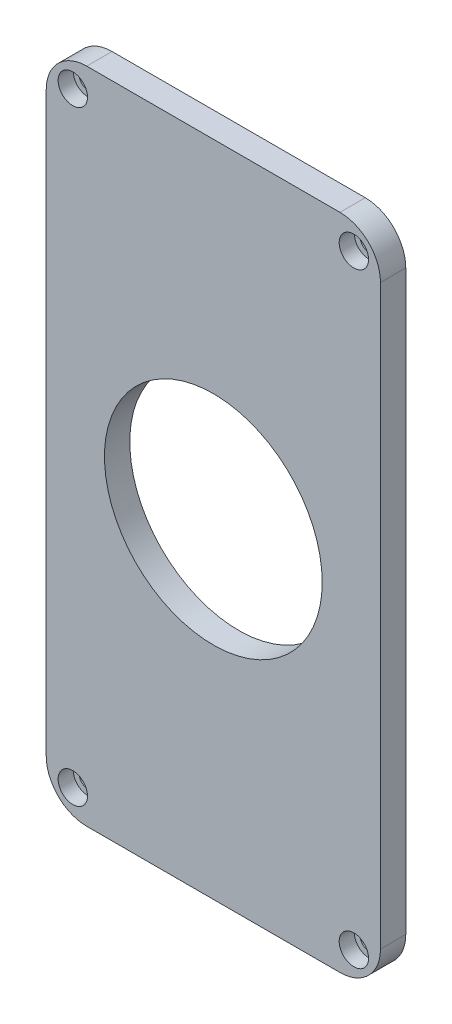
ISO-10303-21;
HEADER;
FILE_DESCRIPTION(('STEP AP214'),'2;1');
FILE_NAME('part.step','',(''),(''),'','','');
FILE_SCHEMA(('AUTOMOTIVE_DESIGN { 1 0 10303 214 1 1 1 1 }'));
ENDSEC;
DATA;
#1=APPLICATION_CONTEXT('core data for automotive mechanical design processes');
#2=APPLICATION_PROTOCOL_DEFINITION('international standard','automotive_design',2000,#1);
#3=PRODUCT_CONTEXT('',#1,'mechanical');
#4=PRODUCT('Part','Part','',(#3));
#5=PRODUCT_RELATED_PRODUCT_CATEGORY('part','',(#4));
#6=PRODUCT_DEFINITION_FORMATION('','',#4);
#7=PRODUCT_DEFINITION_CONTEXT('part definition',#1,'design');
#8=PRODUCT_DEFINITION('design','',#6,#7);
#9=PRODUCT_DEFINITION_SHAPE('','',#8);
#10=(LENGTH_UNIT() NAMED_UNIT(*) SI_UNIT(.MILLI.,.METRE.));
#11=(NAMED_UNIT(*) PLANE_ANGLE_UNIT() SI_UNIT($,.RADIAN.));
#12=(NAMED_UNIT(*) SI_UNIT($,.STERADIAN.) SOLID_ANGLE_UNIT());
#13=UNCERTAINTY_MEASURE_WITH_UNIT(LENGTH_MEASURE(1.E-05),#10,'distance_accuracy_value','');
#14=(GEOMETRIC_REPRESENTATION_CONTEXT(3) GLOBAL_UNCERTAINTY_ASSIGNED_CONTEXT((#13)) GLOBAL_UNIT_ASSIGNED_CONTEXT((#10,
#11,#12)) REPRESENTATION_CONTEXT('',''));
#15=CARTESIAN_POINT('',(0.,0.,0.));
#16=DIRECTION('',(0.,0.,1.));
#17=DIRECTION('',(1.,0.,0.));
#18=AXIS2_PLACEMENT_3D('',#15,#16,#17);
#19=CARTESIAN_POINT('',(-25.,-57.,5.));
#20=DIRECTION('',(0.,0.,-1.));
#21=DIRECTION('',(-1.,0.,0.));
#22=AXIS2_PLACEMENT_3D('',#19,#20,#21);
#23=CYLINDRICAL_SURFACE('',#22,8.);
#24=CARTESIAN_POINT('',(-25.,-57.,0.));
#25=DIRECTION('',(0.,0.,1.));
#26=DIRECTION('',(1.,0.,0.));
#27=AXIS2_PLACEMENT_3D('',#24,#25,#26);
#28=CIRCLE('',#27,8.);
#29=CARTESIAN_POINT('',(-33.,-57.,0.));
#30=VERTEX_POINT('',#29);
#31=CARTESIAN_POINT('',(-25.,-65.,0.));
#32=VERTEX_POINT('',#31);
#33=EDGE_CURVE('E143',#30,#32,#28,.T.);
#34=ORIENTED_EDGE('',*,*,#33,.T.);
#35=DIRECTION('',(0.,0.,-1.));
#36=VECTOR('',#35,1.);
#37=CARTESIAN_POINT('',(-25.,-65.,5.));
#38=LINE('',#37,#36);
#39=CARTESIAN_POINT('',(-25.,-65.,5.));
#40=VERTEX_POINT('',#39);
#41=EDGE_CURVE('E11',#40,#32,#38,.T.);
#42=ORIENTED_EDGE('',*,*,#41,.F.);
#43=CARTESIAN_POINT('',(-25.,-57.,5.));
#44=DIRECTION('',(0.,0.,1.));
#45=DIRECTION('',(1.,0.,0.));
#46=AXIS2_PLACEMENT_3D('',#43,#44,#45);
#47=CIRCLE('',#46,8.);
#48=CARTESIAN_POINT('',(-33.,-57.,5.));
#49=VERTEX_POINT('',#48);
#50=EDGE_CURVE('E158',#49,#40,#47,.T.);
#51=ORIENTED_EDGE('',*,*,#50,.F.);
#52=DIRECTION('',(0.,0.,-1.));
#53=VECTOR('',#52,1.);
#54=CARTESIAN_POINT('',(-33.,-57.,5.));
#55=LINE('',#54,#53);
#56=EDGE_CURVE('E139',#49,#30,#55,.T.);
#57=ORIENTED_EDGE('',*,*,#56,.T.);
#58=EDGE_LOOP('',(#34,#42,#51,#57));
#59=FACE_BOUND('',#58,.T.);
#60=ADVANCED_FACE('F47',(#59),#23,.T.);
#61=CARTESIAN_POINT('',(25.,-65.,5.));
#62=DIRECTION('',(0.,1.,0.));
#63=DIRECTION('',(0.,0.,1.));
#64=AXIS2_PLACEMENT_3D('',#61,#62,#63);
#65=PLANE('',#64);
#66=DIRECTION('',(1.,0.,0.));
#67=VECTOR('',#66,1.);
#68=CARTESIAN_POINT('',(25.,-65.,0.));
#69=LINE('',#68,#67);
#70=CARTESIAN_POINT('',(25.,-65.,0.));
#71=VERTEX_POINT('',#70);
#72=EDGE_CURVE('E146',#32,#71,#69,.T.);
#73=ORIENTED_EDGE('',*,*,#72,.T.);
#74=DIRECTION('',(0.,0.,-1.));
#75=VECTOR('',#74,1.);
#76=CARTESIAN_POINT('',(25.,-65.,5.));
#77=LINE('',#76,#75);
#78=CARTESIAN_POINT('',(25.,-65.,5.));
#79=VERTEX_POINT('',#78);
#80=EDGE_CURVE('E55',#79,#71,#77,.T.);
#81=ORIENTED_EDGE('',*,*,#80,.F.);
#82=DIRECTION('',(1.,0.,0.));
#83=VECTOR('',#82,1.);
#84=CARTESIAN_POINT('',(25.,-65.,5.));
#85=LINE('',#84,#83);
#86=EDGE_CURVE('E106',#40,#79,#85,.T.);
#87=ORIENTED_EDGE('',*,*,#86,.F.);
#88=ORIENTED_EDGE('',*,*,#41,.T.);
#89=EDGE_LOOP('',(#73,#81,#87,#88));
#90=FACE_BOUND('',#89,.T.);
#91=ADVANCED_FACE('F280',(#90),#65,.F.);
#92=CARTESIAN_POINT('',(25.,-57.,5.));
#93=DIRECTION('',(0.,0.,-1.));
#94=DIRECTION('',(-1.,0.,0.));
#95=AXIS2_PLACEMENT_3D('',#92,#93,#94);
#96=CYLINDRICAL_SURFACE('',#95,8.);
#97=CARTESIAN_POINT('',(25.,-57.,0.));
#98=DIRECTION('',(0.,0.,1.));
#99=DIRECTION('',(1.,0.,0.));
#100=AXIS2_PLACEMENT_3D('',#97,#98,#99);
#101=CIRCLE('',#100,8.);
#102=CARTESIAN_POINT('',(33.,-57.,0.));
#103=VERTEX_POINT('',#102);
#104=EDGE_CURVE('E149',#71,#103,#101,.T.);
#105=ORIENTED_EDGE('',*,*,#104,.T.);
#106=DIRECTION('',(0.,0.,-1.));
#107=VECTOR('',#106,1.);
#108=CARTESIAN_POINT('',(33.,-57.,5.));
#109=LINE('',#108,#107);
#110=CARTESIAN_POINT('',(33.,-57.,5.));
#111=VERTEX_POINT('',#110);
#112=EDGE_CURVE('E165',#111,#103,#109,.T.);
#113=ORIENTED_EDGE('',*,*,#112,.F.);
#114=CARTESIAN_POINT('',(25.,-57.,5.));
#115=DIRECTION('',(0.,0.,1.));
#116=DIRECTION('',(1.,0.,0.));
#117=AXIS2_PLACEMENT_3D('',#114,#115,#116);
#118=CIRCLE('',#117,8.);
#119=EDGE_CURVE('E173',#79,#111,#118,.T.);
#120=ORIENTED_EDGE('',*,*,#119,.F.);
#121=ORIENTED_EDGE('',*,*,#80,.T.);
#122=EDGE_LOOP('',(#105,#113,#120,#121));
#123=FACE_BOUND('',#122,.T.);
#124=ADVANCED_FACE('F171',(#123),#96,.T.);
#125=CARTESIAN_POINT('',(33.,57.,5.));
#126=DIRECTION('',(-1.,0.,0.));
#127=DIRECTION('',(0.,-1.,0.));
#128=AXIS2_PLACEMENT_3D('',#125,#126,#127);
#129=PLANE('',#128);
#130=DIRECTION('',(0.,1.,0.));
#131=VECTOR('',#130,1.);
#132=CARTESIAN_POINT('',(33.,57.,0.));
#133=LINE('',#132,#131);
#134=CARTESIAN_POINT('',(33.,57.,0.));
#135=VERTEX_POINT('',#134);
#136=EDGE_CURVE('E151',#103,#135,#133,.T.);
#137=ORIENTED_EDGE('',*,*,#136,.T.);
#138=DIRECTION('',(0.,0.,-1.));
#139=VECTOR('',#138,1.);
#140=CARTESIAN_POINT('',(33.,57.,5.));
#141=LINE('',#140,#139);
#142=CARTESIAN_POINT('',(33.,57.,5.));
#143=VERTEX_POINT('',#142);
#144=EDGE_CURVE('E162',#143,#135,#141,.T.);
#145=ORIENTED_EDGE('',*,*,#144,.F.);
#146=DIRECTION('',(0.,1.,0.));
#147=VECTOR('',#146,1.);
#148=CARTESIAN_POINT('',(33.,57.,5.));
#149=LINE('',#148,#147);
#150=EDGE_CURVE('E185',#111,#143,#149,.T.);
#151=ORIENTED_EDGE('',*,*,#150,.F.);
#152=ORIENTED_EDGE('',*,*,#112,.T.);
#153=EDGE_LOOP('',(#137,#145,#151,#152));
#154=FACE_BOUND('',#153,.T.);
#155=ADVANCED_FACE('F181',(#154),#129,.F.);
#156=CARTESIAN_POINT('',(25.,57.,5.));
#157=DIRECTION('',(0.,0.,-1.));
#158=DIRECTION('',(-1.,0.,0.));
#159=AXIS2_PLACEMENT_3D('',#156,#157,#158);
#160=CYLINDRICAL_SURFACE('',#159,8.);
#161=CARTESIAN_POINT('',(25.,57.,0.));
#162=DIRECTION('',(0.,0.,1.));
#163=DIRECTION('',(1.,0.,0.));
#164=AXIS2_PLACEMENT_3D('',#161,#162,#163);
#165=CIRCLE('',#164,8.);
#166=CARTESIAN_POINT('',(25.,65.,0.));
#167=VERTEX_POINT('',#166);
#168=EDGE_CURVE('E153',#135,#167,#165,.T.);
#169=ORIENTED_EDGE('',*,*,#168,.T.);
#170=DIRECTION('',(0.,0.,-1.));
#171=VECTOR('',#170,1.);
#172=CARTESIAN_POINT('',(25.,65.,5.));
#173=LINE('',#172,#171);
#174=CARTESIAN_POINT('',(25.,65.,5.));
#175=VERTEX_POINT('',#174);
#176=EDGE_CURVE('E134',#175,#167,#173,.T.);
#177=ORIENTED_EDGE('',*,*,#176,.F.);
#178=CARTESIAN_POINT('',(25.,57.,5.));
#179=DIRECTION('',(0.,0.,1.));
#180=DIRECTION('',(1.,0.,0.));
#181=AXIS2_PLACEMENT_3D('',#178,#179,#180);
#182=CIRCLE('',#181,8.);
#183=EDGE_CURVE('E125',#143,#175,#182,.T.);
#184=ORIENTED_EDGE('',*,*,#183,.F.);
#185=ORIENTED_EDGE('',*,*,#144,.T.);
#186=EDGE_LOOP('',(#169,#177,#184,#185));
#187=FACE_BOUND('',#186,.T.);
#188=ADVANCED_FACE('F184',(#187),#160,.T.);
#189=CARTESIAN_POINT('',(25.,65.,5.));
#190=DIRECTION('',(0.,-1.,0.));
#191=DIRECTION('',(0.,0.,-1.));
#192=AXIS2_PLACEMENT_3D('',#189,#190,#191);
#193=PLANE('',#192);
#194=DIRECTION('',(-1.,0.,0.));
#195=VECTOR('',#194,1.);
#196=CARTESIAN_POINT('',(25.,65.,0.));
#197=LINE('',#196,#195);
#198=CARTESIAN_POINT('',(-25.,65.,0.));
#199=VERTEX_POINT('',#198);
#200=EDGE_CURVE('E133',#167,#199,#197,.T.);
#201=ORIENTED_EDGE('',*,*,#200,.T.);
#202=DIRECTION('',(0.,0.,-1.));
#203=VECTOR('',#202,1.);
#204=CARTESIAN_POINT('',(-25.,65.,5.));
#205=LINE('',#204,#203);
#206=CARTESIAN_POINT('',(-25.,65.,5.));
#207=VERTEX_POINT('',#206);
#208=EDGE_CURVE('E130',#207,#199,#205,.T.);
#209=ORIENTED_EDGE('',*,*,#208,.F.);
#210=DIRECTION('',(-1.,0.,0.));
#211=VECTOR('',#210,1.);
#212=CARTESIAN_POINT('',(25.,65.,5.));
#213=LINE('',#212,#211);
#214=EDGE_CURVE('E119',#175,#207,#213,.T.);
#215=ORIENTED_EDGE('',*,*,#214,.F.);
#216=ORIENTED_EDGE('',*,*,#176,.T.);
#217=EDGE_LOOP('',(#201,#209,#215,#216));
#218=FACE_BOUND('',#217,.T.);
#219=ADVANCED_FACE('F131',(#218),#193,.F.);
#220=CARTESIAN_POINT('',(-25.,57.,5.));
#221=DIRECTION('',(0.,0.,-1.));
#222=DIRECTION('',(-1.,0.,0.));
#223=AXIS2_PLACEMENT_3D('',#220,#221,#222);
#224=CYLINDRICAL_SURFACE('',#223,8.);
#225=CARTESIAN_POINT('',(-25.,57.,0.));
#226=DIRECTION('',(0.,0.,1.));
#227=DIRECTION('',(-1.,0.,0.));
#228=AXIS2_PLACEMENT_3D('',#225,#226,#227);
#229=CIRCLE('',#228,8.);
#230=CARTESIAN_POINT('',(-33.,57.,0.));
#231=VERTEX_POINT('',#230);
#232=EDGE_CURVE('E92',#199,#231,#229,.T.);
#233=ORIENTED_EDGE('',*,*,#232,.T.);
#234=DIRECTION('',(0.,0.,-1.));
#235=VECTOR('',#234,1.);
#236=CARTESIAN_POINT('',(-33.,57.,5.));
#237=LINE('',#236,#235);
#238=CARTESIAN_POINT('',(-33.,57.,5.));
#239=VERTEX_POINT('',#238);
#240=EDGE_CURVE('E135',#239,#231,#237,.T.);
#241=ORIENTED_EDGE('',*,*,#240,.F.);
#242=CARTESIAN_POINT('',(-25.,57.,5.));
#243=DIRECTION('',(0.,0.,1.));
#244=DIRECTION('',(-1.,0.,0.));
#245=AXIS2_PLACEMENT_3D('',#242,#243,#244);
#246=CIRCLE('',#245,8.);
#247=EDGE_CURVE('E123',#207,#239,#246,.T.);
#248=ORIENTED_EDGE('',*,*,#247,.F.);
#249=ORIENTED_EDGE('',*,*,#208,.T.);
#250=EDGE_LOOP('',(#233,#241,#248,#249));
#251=FACE_BOUND('',#250,.T.);
#252=ADVANCED_FACE('F137',(#251),#224,.T.);
#253=CARTESIAN_POINT('',(-33.,57.,5.));
#254=DIRECTION('',(1.,0.,0.));
#255=DIRECTION('',(0.,0.,-1.));
#256=AXIS2_PLACEMENT_3D('',#253,#254,#255);
#257=PLANE('',#256);
#258=DIRECTION('',(0.,-1.,0.));
#259=VECTOR('',#258,1.);
#260=CARTESIAN_POINT('',(-33.,57.,0.));
#261=LINE('',#260,#259);
#262=EDGE_CURVE('E98',#231,#30,#261,.T.);
#263=ORIENTED_EDGE('',*,*,#262,.T.);
#264=ORIENTED_EDGE('',*,*,#56,.F.);
#265=DIRECTION('',(0.,-1.,0.));
#266=VECTOR('',#265,1.);
#267=CARTESIAN_POINT('',(-33.,57.,5.));
#268=LINE('',#267,#266);
#269=EDGE_CURVE('E63',#239,#49,#268,.T.);
#270=ORIENTED_EDGE('',*,*,#269,.F.);
#271=ORIENTED_EDGE('',*,*,#240,.T.);
#272=EDGE_LOOP('',(#263,#264,#270,#271));
#273=FACE_BOUND('',#272,.T.);
#274=ADVANCED_FACE('F263',(#273),#257,.F.);
#275=CARTESIAN_POINT('',(-25.,-57.,5.));
#276=DIRECTION('',(0.,0.,1.));
#277=DIRECTION('',(1.,0.,0.));
#278=AXIS2_PLACEMENT_3D('',#275,#276,#277);
#279=PLANE('',#278);
#280=CARTESIAN_POINT('',(27.75,-59.75,5.));
#281=DIRECTION('',(0.,0.,1.));
#282=DIRECTION('',(1.,0.,0.));
#283=AXIS2_PLACEMENT_3D('',#280,#281,#282);
#284=CIRCLE('',#283,2.9);
#285=CARTESIAN_POINT('',(30.65,-59.75,5.));
#286=VERTEX_POINT('',#285);
#287=EDGE_CURVE('E206',#286,#286,#284,.T.);
#288=ORIENTED_EDGE('',*,*,#287,.F.);
#289=EDGE_LOOP('',(#288));
#290=FACE_BOUND('',#289,.T.);
#291=CARTESIAN_POINT('',(-27.75,59.75,5.));
#292=DIRECTION('',(0.,0.,1.));
#293=DIRECTION('',(1.,0.,0.));
#294=AXIS2_PLACEMENT_3D('',#291,#292,#293);
#295=CIRCLE('',#294,2.9);
#296=CARTESIAN_POINT('',(-24.85,59.75,5.));
#297=VERTEX_POINT('',#296);
#298=EDGE_CURVE('E213',#297,#297,#295,.T.);
#299=ORIENTED_EDGE('',*,*,#298,.F.);
#300=EDGE_LOOP('',(#299));
#301=FACE_BOUND('',#300,.T.);
#302=CARTESIAN_POINT('',(-27.75,-59.75,5.));
#303=DIRECTION('',(0.,0.,1.));
#304=DIRECTION('',(-1.,0.,0.));
#305=AXIS2_PLACEMENT_3D('',#302,#303,#304);
#306=CIRCLE('',#305,2.9);
#307=CARTESIAN_POINT('',(-30.65,-59.75,5.));
#308=VERTEX_POINT('',#307);
#309=EDGE_CURVE('E200',#308,#308,#306,.T.);
#310=ORIENTED_EDGE('',*,*,#309,.F.);
#311=EDGE_LOOP('',(#310));
#312=FACE_BOUND('',#311,.T.);
#313=CARTESIAN_POINT('',(27.75,59.75,5.));
#314=DIRECTION('',(0.,0.,1.));
#315=DIRECTION('',(-1.,0.,0.));
#316=AXIS2_PLACEMENT_3D('',#313,#314,#315);
#317=CIRCLE('',#316,2.9);
#318=CARTESIAN_POINT('',(24.85,59.75,5.));
#319=VERTEX_POINT('',#318);
#320=EDGE_CURVE('E197',#319,#319,#317,.T.);
#321=ORIENTED_EDGE('',*,*,#320,.F.);
#322=EDGE_LOOP('',(#321));
#323=FACE_BOUND('',#322,.T.);
#324=CARTESIAN_POINT('',(0.,0.,5.));
#325=DIRECTION('',(0.,0.,1.));
#326=DIRECTION('',(1.,0.,0.));
#327=AXIS2_PLACEMENT_3D('',#324,#325,#326);
#328=CIRCLE('',#327,21.5);
#329=CARTESIAN_POINT('',(21.5,0.,5.));
#330=VERTEX_POINT('',#329);
#331=EDGE_CURVE('E191',#330,#330,#328,.T.);
#332=ORIENTED_EDGE('',*,*,#331,.F.);
#333=EDGE_LOOP('',(#332));
#334=FACE_BOUND('',#333,.T.);
#335=ORIENTED_EDGE('',*,*,#50,.T.);
#336=ORIENTED_EDGE('',*,*,#86,.T.);
#337=ORIENTED_EDGE('',*,*,#119,.T.);
#338=ORIENTED_EDGE('',*,*,#150,.T.);
#339=ORIENTED_EDGE('',*,*,#183,.T.);
#340=ORIENTED_EDGE('',*,*,#214,.T.);
#341=ORIENTED_EDGE('',*,*,#247,.T.);
#342=ORIENTED_EDGE('',*,*,#269,.T.);
#343=EDGE_LOOP('',(#335,#336,#337,#338,#339,#340,#341,#342));
#344=FACE_BOUND('',#343,.T.);
#345=ADVANCED_FACE('F121',(#290,#301,#312,#323,#334,#344),#279,.T.);
#346=CARTESIAN_POINT('',(-25.,-57.,0.));
#347=DIRECTION('',(0.,0.,1.));
#348=DIRECTION('',(1.,0.,0.));
#349=AXIS2_PLACEMENT_3D('',#346,#347,#348);
#350=PLANE('',#349);
#351=CARTESIAN_POINT('',(-27.75,-59.75,0.));
#352=DIRECTION('',(0.,0.,1.));
#353=DIRECTION('',(-1.,0.,0.));
#354=AXIS2_PLACEMENT_3D('',#351,#352,#353);
#355=CIRCLE('',#354,1.75);
#356=CARTESIAN_POINT('',(-29.5,-59.75,0.));
#357=VERTEX_POINT('',#356);
#358=EDGE_CURVE('E227',#357,#357,#355,.T.);
#359=ORIENTED_EDGE('',*,*,#358,.T.);
#360=EDGE_LOOP('',(#359));
#361=FACE_BOUND('',#360,.T.);
#362=CARTESIAN_POINT('',(27.75,-59.75,0.));
#363=DIRECTION('',(0.,0.,1.));
#364=DIRECTION('',(1.,0.,0.));
#365=AXIS2_PLACEMENT_3D('',#362,#363,#364);
#366=CIRCLE('',#365,1.75);
#367=CARTESIAN_POINT('',(29.5,-59.75,0.));
#368=VERTEX_POINT('',#367);
#369=EDGE_CURVE('E233',#368,#368,#366,.T.);
#370=ORIENTED_EDGE('',*,*,#369,.T.);
#371=EDGE_LOOP('',(#370));
#372=FACE_BOUND('',#371,.T.);
#373=CARTESIAN_POINT('',(27.75,59.75,0.));
#374=DIRECTION('',(0.,0.,1.));
#375=DIRECTION('',(-1.,0.,0.));
#376=AXIS2_PLACEMENT_3D('',#373,#374,#375);
#377=CIRCLE('',#376,1.75);
#378=CARTESIAN_POINT('',(26.,59.75,0.));
#379=VERTEX_POINT('',#378);
#380=EDGE_CURVE('E239',#379,#379,#377,.T.);
#381=ORIENTED_EDGE('',*,*,#380,.T.);
#382=EDGE_LOOP('',(#381));
#383=FACE_BOUND('',#382,.T.);
#384=CARTESIAN_POINT('',(-27.75,59.75,0.));
#385=DIRECTION('',(0.,0.,1.));
#386=DIRECTION('',(1.,0.,0.));
#387=AXIS2_PLACEMENT_3D('',#384,#385,#386);
#388=CIRCLE('',#387,1.75);
#389=CARTESIAN_POINT('',(-26.,59.75,0.));
#390=VERTEX_POINT('',#389);
#391=EDGE_CURVE('E207',#390,#390,#388,.T.);
#392=ORIENTED_EDGE('',*,*,#391,.T.);
#393=EDGE_LOOP('',(#392));
#394=FACE_BOUND('',#393,.T.);
#395=CARTESIAN_POINT('',(0.,0.,0.));
#396=DIRECTION('',(0.,0.,1.));
#397=DIRECTION('',(1.,0.,0.));
#398=AXIS2_PLACEMENT_3D('',#395,#396,#397);
#399=CIRCLE('',#398,21.5);
#400=CARTESIAN_POINT('',(21.5,0.,0.));
#401=VERTEX_POINT('',#400);
#402=EDGE_CURVE('E147',#401,#401,#399,.T.);
#403=ORIENTED_EDGE('',*,*,#402,.T.);
#404=EDGE_LOOP('',(#403));
#405=FACE_BOUND('',#404,.T.);
#406=ORIENTED_EDGE('',*,*,#33,.F.);
#407=ORIENTED_EDGE('',*,*,#262,.F.);
#408=ORIENTED_EDGE('',*,*,#232,.F.);
#409=ORIENTED_EDGE('',*,*,#200,.F.);
#410=ORIENTED_EDGE('',*,*,#168,.F.);
#411=ORIENTED_EDGE('',*,*,#136,.F.);
#412=ORIENTED_EDGE('',*,*,#104,.F.);
#413=ORIENTED_EDGE('',*,*,#72,.F.);
#414=EDGE_LOOP('',(#406,#407,#408,#409,#410,#411,#412,#413));
#415=FACE_BOUND('',#414,.T.);
#416=ADVANCED_FACE('F177',(#361,#372,#383,#394,#405,#415),#350,.F.);
#417=CARTESIAN_POINT('',(0.,0.,0.));
#418=DIRECTION('',(0.,0.,1.));
#419=DIRECTION('',(1.,0.,0.));
#420=AXIS2_PLACEMENT_3D('',#417,#418,#419);
#421=CYLINDRICAL_SURFACE('',#420,21.5);
#422=ORIENTED_EDGE('',*,*,#402,.F.);
#423=EDGE_LOOP('',(#422));
#424=FACE_BOUND('',#423,.T.);
#425=ORIENTED_EDGE('',*,*,#331,.T.);
#426=EDGE_LOOP('',(#425));
#427=FACE_BOUND('',#426,.T.);
#428=ADVANCED_FACE('F257',(#424,#427),#421,.F.);
#429=CARTESIAN_POINT('',(27.75,59.75,2.));
#430=DIRECTION('',(0.,0.,1.));
#431=DIRECTION('',(1.,0.,0.));
#432=AXIS2_PLACEMENT_3D('',#429,#430,#431);
#433=CYLINDRICAL_SURFACE('',#432,2.9);
#434=CARTESIAN_POINT('',(27.75,59.75,2.));
#435=DIRECTION('',(0.,0.,1.));
#436=DIRECTION('',(-1.,0.,0.));
#437=AXIS2_PLACEMENT_3D('',#434,#435,#436);
#438=CIRCLE('',#437,2.9);
#439=CARTESIAN_POINT('',(24.85,59.75,2.));
#440=VERTEX_POINT('',#439);
#441=EDGE_CURVE('E194',#440,#440,#438,.T.);
#442=ORIENTED_EDGE('',*,*,#441,.F.);
#443=EDGE_LOOP('',(#442));
#444=FACE_BOUND('',#443,.T.);
#445=ORIENTED_EDGE('',*,*,#320,.T.);
#446=EDGE_LOOP('',(#445));
#447=FACE_BOUND('',#446,.T.);
#448=ADVANCED_FACE('F251',(#444,#447),#433,.F.);
#449=CARTESIAN_POINT('',(27.75,59.75,2.));
#450=DIRECTION('',(0.,0.,-1.));
#451=DIRECTION('',(-1.,0.,0.));
#452=AXIS2_PLACEMENT_3D('',#449,#450,#451);
#453=PLANE('',#452);
#454=CARTESIAN_POINT('',(27.75,59.75,2.));
#455=DIRECTION('',(0.,0.,1.));
#456=DIRECTION('',(-1.,0.,0.));
#457=AXIS2_PLACEMENT_3D('',#454,#455,#456);
#458=CIRCLE('',#457,1.75);
#459=CARTESIAN_POINT('',(26.,59.75,2.));
#460=VERTEX_POINT('',#459);
#461=EDGE_CURVE('E224',#460,#460,#458,.T.);
#462=ORIENTED_EDGE('',*,*,#461,.F.);
#463=EDGE_LOOP('',(#462));
#464=FACE_BOUND('',#463,.T.);
#465=ORIENTED_EDGE('',*,*,#441,.T.);
#466=EDGE_LOOP('',(#465));
#467=FACE_BOUND('',#466,.T.);
#468=ADVANCED_FACE('F247',(#464,#467),#453,.F.);
#469=CARTESIAN_POINT('',(-27.75,-59.75,2.));
#470=DIRECTION('',(0.,0.,1.));
#471=DIRECTION('',(1.,0.,0.));
#472=AXIS2_PLACEMENT_3D('',#469,#470,#471);
#473=CYLINDRICAL_SURFACE('',#472,2.9);
#474=CARTESIAN_POINT('',(-27.75,-59.75,2.));
#475=DIRECTION('',(0.,0.,1.));
#476=DIRECTION('',(-1.,0.,0.));
#477=AXIS2_PLACEMENT_3D('',#474,#475,#476);
#478=CIRCLE('',#477,2.9);
#479=CARTESIAN_POINT('',(-30.65,-59.75,2.));
#480=VERTEX_POINT('',#479);
#481=EDGE_CURVE('E216',#480,#480,#478,.T.);
#482=ORIENTED_EDGE('',*,*,#481,.F.);
#483=EDGE_LOOP('',(#482));
#484=FACE_BOUND('',#483,.T.);
#485=ORIENTED_EDGE('',*,*,#309,.T.);
#486=EDGE_LOOP('',(#485));
#487=FACE_BOUND('',#486,.T.);
#488=ADVANCED_FACE('F250',(#484,#487),#473,.F.);
#489=CARTESIAN_POINT('',(-27.75,-59.75,2.));
#490=DIRECTION('',(0.,0.,-1.));
#491=DIRECTION('',(-1.,0.,0.));
#492=AXIS2_PLACEMENT_3D('',#489,#490,#491);
#493=PLANE('',#492);
#494=CARTESIAN_POINT('',(-27.75,-59.75,2.));
#495=DIRECTION('',(0.,0.,1.));
#496=DIRECTION('',(-1.,0.,0.));
#497=AXIS2_PLACEMENT_3D('',#494,#495,#496);
#498=CIRCLE('',#497,1.75);
#499=CARTESIAN_POINT('',(-29.5,-59.75,2.));
#500=VERTEX_POINT('',#499);
#501=EDGE_CURVE('E230',#500,#500,#498,.T.);
#502=ORIENTED_EDGE('',*,*,#501,.F.);
#503=EDGE_LOOP('',(#502));
#504=FACE_BOUND('',#503,.T.);
#505=ORIENTED_EDGE('',*,*,#481,.T.);
#506=EDGE_LOOP('',(#505));
#507=FACE_BOUND('',#506,.T.);
#508=ADVANCED_FACE('F355',(#504,#507),#493,.F.);
#509=CARTESIAN_POINT('',(-27.75,59.75,2.));
#510=DIRECTION('',(0.,0.,1.));
#511=DIRECTION('',(1.,0.,0.));
#512=AXIS2_PLACEMENT_3D('',#509,#510,#511);
#513=CYLINDRICAL_SURFACE('',#512,2.9);
#514=CARTESIAN_POINT('',(-27.75,59.75,2.));
#515=DIRECTION('',(0.,0.,1.));
#516=DIRECTION('',(1.,0.,0.));
#517=AXIS2_PLACEMENT_3D('',#514,#515,#516);
#518=CIRCLE('',#517,2.9);
#519=CARTESIAN_POINT('',(-24.85,59.75,2.));
#520=VERTEX_POINT('',#519);
#521=EDGE_CURVE('E210',#520,#520,#518,.T.);
#522=ORIENTED_EDGE('',*,*,#521,.F.);
#523=EDGE_LOOP('',(#522));
#524=FACE_BOUND('',#523,.T.);
#525=ORIENTED_EDGE('',*,*,#298,.T.);
#526=EDGE_LOOP('',(#525));
#527=FACE_BOUND('',#526,.T.);
#528=ADVANCED_FACE('F359',(#524,#527),#513,.F.);
#529=CARTESIAN_POINT('',(-27.75,59.75,2.));
#530=DIRECTION('',(0.,0.,1.));
#531=DIRECTION('',(1.,0.,0.));
#532=AXIS2_PLACEMENT_3D('',#529,#530,#531);
#533=PLANE('',#532);
#534=CARTESIAN_POINT('',(-27.75,59.75,2.));
#535=DIRECTION('',(0.,0.,1.));
#536=DIRECTION('',(1.,0.,0.));
#537=AXIS2_PLACEMENT_3D('',#534,#535,#536);
#538=CIRCLE('',#537,1.75);
#539=CARTESIAN_POINT('',(-26.,59.75,2.));
#540=VERTEX_POINT('',#539);
#541=EDGE_CURVE('E221',#540,#540,#538,.T.);
#542=ORIENTED_EDGE('',*,*,#541,.F.);
#543=EDGE_LOOP('',(#542));
#544=FACE_BOUND('',#543,.T.);
#545=ORIENTED_EDGE('',*,*,#521,.T.);
#546=EDGE_LOOP('',(#545));
#547=FACE_BOUND('',#546,.T.);
#548=ADVANCED_FACE('F366',(#544,#547),#533,.T.);
#549=CARTESIAN_POINT('',(27.75,-59.75,2.));
#550=DIRECTION('',(0.,0.,1.));
#551=DIRECTION('',(1.,0.,0.));
#552=AXIS2_PLACEMENT_3D('',#549,#550,#551);
#553=CYLINDRICAL_SURFACE('',#552,2.9);
#554=CARTESIAN_POINT('',(27.75,-59.75,2.));
#555=DIRECTION('',(0.,0.,1.));
#556=DIRECTION('',(1.,0.,0.));
#557=AXIS2_PLACEMENT_3D('',#554,#555,#556);
#558=CIRCLE('',#557,2.9);
#559=CARTESIAN_POINT('',(30.65,-59.75,2.));
#560=VERTEX_POINT('',#559);
#561=EDGE_CURVE('E203',#560,#560,#558,.T.);
#562=ORIENTED_EDGE('',*,*,#561,.F.);
#563=EDGE_LOOP('',(#562));
#564=FACE_BOUND('',#563,.T.);
#565=ORIENTED_EDGE('',*,*,#287,.T.);
#566=EDGE_LOOP('',(#565));
#567=FACE_BOUND('',#566,.T.);
#568=ADVANCED_FACE('F343',(#564,#567),#553,.F.);
#569=CARTESIAN_POINT('',(27.75,-59.75,2.));
#570=DIRECTION('',(0.,0.,1.));
#571=DIRECTION('',(1.,0.,0.));
#572=AXIS2_PLACEMENT_3D('',#569,#570,#571);
#573=PLANE('',#572);
#574=CARTESIAN_POINT('',(27.75,-59.75,2.));
#575=DIRECTION('',(0.,0.,1.));
#576=DIRECTION('',(1.,0.,0.));
#577=AXIS2_PLACEMENT_3D('',#574,#575,#576);
#578=CIRCLE('',#577,1.75);
#579=CARTESIAN_POINT('',(29.5,-59.75,2.));
#580=VERTEX_POINT('',#579);
#581=EDGE_CURVE('E236',#580,#580,#578,.T.);
#582=ORIENTED_EDGE('',*,*,#581,.F.);
#583=EDGE_LOOP('',(#582));
#584=FACE_BOUND('',#583,.T.);
#585=ORIENTED_EDGE('',*,*,#561,.T.);
#586=EDGE_LOOP('',(#585));
#587=FACE_BOUND('',#586,.T.);
#588=ADVANCED_FACE('F375',(#584,#587),#573,.T.);
#589=CARTESIAN_POINT('',(-27.75,59.75,0.));
#590=DIRECTION('',(0.,0.,1.));
#591=DIRECTION('',(1.,0.,0.));
#592=AXIS2_PLACEMENT_3D('',#589,#590,#591);
#593=CYLINDRICAL_SURFACE('',#592,1.75);
#594=ORIENTED_EDGE('',*,*,#391,.F.);
#595=EDGE_LOOP('',(#594));
#596=FACE_BOUND('',#595,.T.);
#597=ORIENTED_EDGE('',*,*,#541,.T.);
#598=EDGE_LOOP('',(#597));
#599=FACE_BOUND('',#598,.T.);
#600=ADVANCED_FACE('F379',(#596,#599),#593,.F.);
#601=CARTESIAN_POINT('',(27.75,59.75,0.));
#602=DIRECTION('',(0.,0.,1.));
#603=DIRECTION('',(1.,0.,0.));
#604=AXIS2_PLACEMENT_3D('',#601,#602,#603);
#605=CYLINDRICAL_SURFACE('',#604,1.75);
#606=ORIENTED_EDGE('',*,*,#380,.F.);
#607=EDGE_LOOP('',(#606));
#608=FACE_BOUND('',#607,.T.);
#609=ORIENTED_EDGE('',*,*,#461,.T.);
#610=EDGE_LOOP('',(#609));
#611=FACE_BOUND('',#610,.T.);
#612=ADVANCED_FACE('F245',(#608,#611),#605,.F.);
#613=CARTESIAN_POINT('',(27.75,-59.75,0.));
#614=DIRECTION('',(0.,0.,1.));
#615=DIRECTION('',(1.,0.,0.));
#616=AXIS2_PLACEMENT_3D('',#613,#614,#615);
#617=CYLINDRICAL_SURFACE('',#616,1.75);
#618=ORIENTED_EDGE('',*,*,#369,.F.);
#619=EDGE_LOOP('',(#618));
#620=FACE_BOUND('',#619,.T.);
#621=ORIENTED_EDGE('',*,*,#581,.T.);
#622=EDGE_LOOP('',(#621));
#623=FACE_BOUND('',#622,.T.);
#624=ADVANCED_FACE('F396',(#620,#623),#617,.F.);
#625=CARTESIAN_POINT('',(-27.75,-59.75,0.));
#626=DIRECTION('',(0.,0.,1.));
#627=DIRECTION('',(1.,0.,0.));
#628=AXIS2_PLACEMENT_3D('',#625,#626,#627);
#629=CYLINDRICAL_SURFACE('',#628,1.75);
#630=ORIENTED_EDGE('',*,*,#358,.F.);
#631=EDGE_LOOP('',(#630));
#632=FACE_BOUND('',#631,.T.);
#633=ORIENTED_EDGE('',*,*,#501,.T.);
#634=EDGE_LOOP('',(#633));
#635=FACE_BOUND('',#634,.T.);
#636=ADVANCED_FACE('F405',(#632,#635),#629,.F.);
#637=CLOSED_SHELL('',(#60,#91,#124,#155,#188,#219,#252,#274,#345,#416,#428,#448,#468,#488,#508,
#528,#548,#568,#588,#600,#612,#624,#636));
#638=MANIFOLD_SOLID_BREP('B2',#637);
#639=ADVANCED_BREP_SHAPE_REPRESENTATION('',(#18,#638),#14);
#640=SHAPE_DEFINITION_REPRESENTATION(#9,#639);
ENDSEC;
END-ISO-10303-21;
